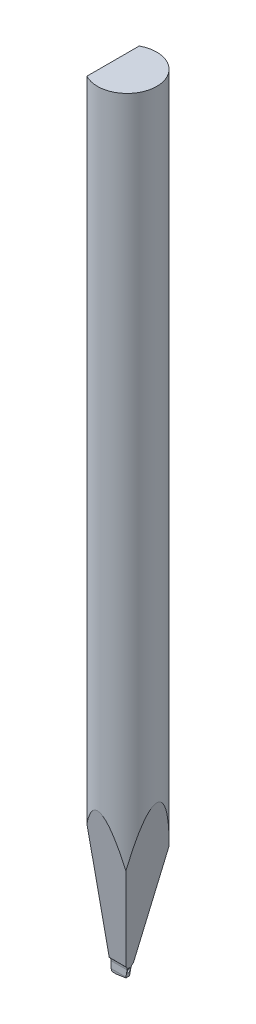
ISO-10303-21;
HEADER;
FILE_DESCRIPTION(('STEP AP214'),'2;1');
FILE_NAME('part.step','',(''),(''),'','','');
FILE_SCHEMA(('AUTOMOTIVE_DESIGN { 1 0 10303 214 1 1 1 1 }'));
ENDSEC;
DATA;
#1=APPLICATION_CONTEXT('core data for automotive mechanical design processes');
#2=APPLICATION_PROTOCOL_DEFINITION('international standard','automotive_design',2000,#1);
#3=PRODUCT_CONTEXT('',#1,'mechanical');
#4=PRODUCT('Part','Part','',(#3));
#5=PRODUCT_RELATED_PRODUCT_CATEGORY('part','',(#4));
#6=PRODUCT_DEFINITION_FORMATION('','',#4);
#7=PRODUCT_DEFINITION_CONTEXT('part definition',#1,'design');
#8=PRODUCT_DEFINITION('design','',#6,#7);
#9=PRODUCT_DEFINITION_SHAPE('','',#8);
#10=(LENGTH_UNIT() NAMED_UNIT(*) SI_UNIT(.MILLI.,.METRE.));
#11=(NAMED_UNIT(*) PLANE_ANGLE_UNIT() SI_UNIT($,.RADIAN.));
#12=(NAMED_UNIT(*) SI_UNIT($,.STERADIAN.) SOLID_ANGLE_UNIT());
#13=UNCERTAINTY_MEASURE_WITH_UNIT(LENGTH_MEASURE(1.E-05),#10,'distance_accuracy_value','');
#14=(GEOMETRIC_REPRESENTATION_CONTEXT(3) GLOBAL_UNCERTAINTY_ASSIGNED_CONTEXT((#13)) GLOBAL_UNIT_ASSIGNED_CONTEXT((#10,
#11,#12)) REPRESENTATION_CONTEXT('',''));
#15=CARTESIAN_POINT('',(0.,0.,0.));
#16=DIRECTION('',(0.,0.,1.));
#17=DIRECTION('',(1.,0.,0.));
#18=AXIS2_PLACEMENT_3D('',#15,#16,#17);
#19=CARTESIAN_POINT('',(26.8389469491216,-0.126489968,0.));
#20=DIRECTION('',(-1.,0.,0.));
#21=DIRECTION('',(0.,0.,1.));
#22=AXIS2_PLACEMENT_3D('',#19,#20,#21);
#23=CYLINDRICAL_SURFACE('',#22,0.12954);
#24=DIRECTION('',(-1.,0.,0.));
#25=VECTOR('',#24,1.);
#26=CARTESIAN_POINT('',(26.8389469491216,0.00289430113655306,-0.00635));
#27=LINE('',#26,#25);
#28=CARTESIAN_POINT('',(-0.337230459838859,0.00289430113655353,-0.00635));
#29=VERTEX_POINT('',#28);
#30=CARTESIAN_POINT('',(-0.322517644099109,0.00289430113655363,-0.00635));
#31=VERTEX_POINT('',#30);
#32=EDGE_CURVE('E255',#29,#31,#27,.F.);
#33=ORIENTED_EDGE('',*,*,#32,.F.);
#34=CARTESIAN_POINT('',(-0.69271081772419,-0.126489968,0.));
#35=DIRECTION('',(-0.342020143325664,0.93969262078591,0.));
#36=DIRECTION('',(-0.93969262078591,-0.342020143325664,0.));
#37=AXIS2_PLACEMENT_3D('',#34,#35,#36);
#38=ELLIPSE('',#37,0.378749621997132,0.12954);
#39=CARTESIAN_POINT('',(-0.337230459838859,0.00289430113655353,0.00635));
#40=VERTEX_POINT('',#39);
#41=EDGE_CURVE('E248',#29,#40,#38,.F.);
#42=ORIENTED_EDGE('',*,*,#41,.T.);
#43=DIRECTION('',(-1.,0.,0.));
#44=VECTOR('',#43,1.);
#45=CARTESIAN_POINT('',(26.8389469491216,0.00289430113655306,0.00635));
#46=LINE('',#45,#44);
#47=CARTESIAN_POINT('',(-0.322517644099109,0.00289430113655363,0.00635));
#48=VERTEX_POINT('',#47);
#49=EDGE_CURVE('E242',#40,#48,#46,.F.);
#50=ORIENTED_EDGE('',*,*,#49,.T.);
#51=CARTESIAN_POINT('',(-0.295481475982011,0.000535429460507921,-0.0254));
#52=CARTESIAN_POINT('',(-0.297198816837772,0.000534215832045812,-0.0254008537884807));
#53=CARTESIAN_POINT('',(-0.298919188823835,0.000561492688278354,-0.0252693542141985));
#54=CARTESIAN_POINT('',(-0.302323221500918,0.000668085088640239,-0.0247303484357372));
#55=CARTESIAN_POINT('',(-0.304006644366186,0.00074767088315698,-0.0243214085003927));
#56=CARTESIAN_POINT('',(-0.307281423892028,0.000954246567589712,-0.0232138391776755));
#57=CARTESIAN_POINT('',(-0.308872395127258,0.00108142046193833,-0.022514084145628));
#58=CARTESIAN_POINT('',(-0.311888705466639,0.00136727278414656,-0.0208294490435858));
#59=CARTESIAN_POINT('',(-0.313314453656703,0.00152587064657108,-0.019845295222508));
#60=CARTESIAN_POINT('',(-0.315802552560778,0.00183491730266456,-0.017729896179951));
#61=CARTESIAN_POINT('',(-0.31688733090877,0.00198447720949578,-0.0166248895362638));
#62=CARTESIAN_POINT('',(-0.318834628353974,0.00227153607517136,-0.014231435594532));
#63=CARTESIAN_POINT('',(-0.319697146095778,0.00240903496046091,-0.0129429871778831));
#64=CARTESIAN_POINT('',(-0.321101404041129,0.00264253512620201,-0.0103422488392302));
#65=CARTESIAN_POINT('',(-0.321664418803657,0.00274109517359781,-0.00904163422654978));
#66=CARTESIAN_POINT('',(-0.322557107099311,0.0029007283002986,-0.006360700983063));
#67=CARTESIAN_POINT('',(-0.322886873312254,0.00296181626761226,-0.00498041424553057));
#68=CARTESIAN_POINT('',(-0.323294507475622,0.00303774254032754,-0.00223556775882093));
#69=CARTESIAN_POINT('',(-0.323381442228622,0.00305424477524811,-0.000872392083877149));
#70=CARTESIAN_POINT('',(-0.323326902262496,0.00304397780016551,0.00184919772746693));
#71=CARTESIAN_POINT('',(-0.323185442856485,0.00301721149118319,0.00320761217697293));
#72=CARTESIAN_POINT('',(-0.322680814845049,0.00292384915717186,0.00586785072119308));
#73=CARTESIAN_POINT('',(-0.322319738671362,0.00285762915339363,0.00717008616312412));
#74=CARTESIAN_POINT('',(-0.321388608005533,0.00269291180724166,0.00969522980929863));
#75=CARTESIAN_POINT('',(-0.32081855750335,0.00259441508113291,0.0109181395275877));
#76=CARTESIAN_POINT('',(-0.319480287297602,0.00237464209728323,0.0132637439490038));
#77=CARTESIAN_POINT('',(-0.318710192462401,0.00225315341778143,0.014385347177932));
#78=CARTESIAN_POINT('',(-0.316998432307603,0.00200089434029428,0.0164873592595305));
#79=CARTESIAN_POINT('',(-0.316056755837209,0.00187012333940415,0.0174677589282051));
#80=CARTESIAN_POINT('',(-0.313995064049818,0.00160792328998953,0.0192984032571108));
#81=CARTESIAN_POINT('',(-0.312870012632793,0.00147662750217606,0.0201429832465612));
#82=CARTESIAN_POINT('',(-0.310500423350918,0.00123093130211308,0.0216463862671867));
#83=CARTESIAN_POINT('',(-0.309255837624392,0.00111653770444698,0.0223051344719556));
#84=CARTESIAN_POINT('',(-0.30658799406044,0.000907155794846376,0.0234725569596421));
#85=CARTESIAN_POINT('',(-0.305158324318323,0.000814175030349454,0.0239668925489424));
#86=CARTESIAN_POINT('',(-0.302240803964317,0.000666682258769199,0.0247378411086488));
#87=CARTESIAN_POINT('',(-0.300752967484489,0.00061216096820831,0.0250145066228529));
#88=CARTESIAN_POINT('',(-0.298000997202902,0.000549419787353061,0.0253297889719289));
#89=CARTESIAN_POINT('',(-0.296740602874197,0.000535029310542213,0.0254002304027708));
#90=CARTESIAN_POINT('',(-0.29548147598203,0.000535429460480635,0.0254000000001634));
#91=B_SPLINE_CURVE_WITH_KNOTS('',3,(#51,#52,#53,#54,#55,#56,#57,#58,#59,#60,#61,#62,#63,#64,#65,
#66,#67,#68,#69,#70,#71,#72,#73,#74,#75,#76,#77,#78,#79,#80,#81,#82,#83,#84,#85,#86,#87,#88,#89,
#90),.UNSPECIFIED.,.F.,.F.,(4,2,2,2,2,2,2,2,2,2,2,2,2,2,2,2,2,2,2,4),(0.,0.00515143035645815,
0.0103296866486899,0.0155281756590848,0.020713505225648,0.025355200998644,0.0299969250773136,
0.0342376571652065,0.0384767032773336,0.0425552102633464,0.0466334438095344,0.0506734171044807,
0.0547133132680188,0.0587925373515595,0.0628720266314898,0.0670924109282963,0.0713144921732156,
0.0758426019125559,0.080369618267126,0.0841472441212815),.UNSPECIFIED.);
#92=CARTESIAN_POINT('',(-0.295481475982011,0.000535429460507854,0.0254));
#93=VERTEX_POINT('',#92);
#94=EDGE_CURVE('E453',#48,#93,#91,.T.);
#95=ORIENTED_EDGE('',*,*,#94,.T.);
#96=DIRECTION('',(-1.,0.,0.));
#97=VECTOR('',#96,1.);
#98=CARTESIAN_POINT('',(26.8389469491216,0.000535429460507867,0.0254));
#99=LINE('',#98,#97);
#100=CARTESIAN_POINT('',(-0.248423428634931,0.000535429460507867,0.0254));
#101=VERTEX_POINT('',#100);
#102=EDGE_CURVE('E452',#101,#93,#99,.T.);
#103=ORIENTED_EDGE('',*,*,#102,.F.);
#104=CARTESIAN_POINT('',(-0.968820255882422,-0.126489968,0.));
#105=DIRECTION('',(-0.173648177666931,0.984807753012208,0.));
#106=DIRECTION('',(-0.984807753012208,-0.173648177666931,0.));
#107=AXIS2_PLACEMENT_3D('',#104,#105,#106);
#108=ELLIPSE('',#107,0.745991128386422,0.12954);
#109=CARTESIAN_POINT('',(-0.251459999999998,0.,0.0279445807869608));
#110=VERTEX_POINT('',#109);
#111=EDGE_CURVE('E296',#110,#101,#108,.T.);
#112=ORIENTED_EDGE('',*,*,#111,.F.);
#113=DIRECTION('',(-1.,0.,0.));
#114=VECTOR('',#113,1.);
#115=CARTESIAN_POINT('',(26.8389469491216,0.,0.0279445807869608));
#116=LINE('',#115,#114);
#117=CARTESIAN_POINT('',(-0.34798,0.,0.0279445807869622));
#118=VERTEX_POINT('',#117);
#119=EDGE_CURVE('E294',#110,#118,#116,.T.);
#120=ORIENTED_EDGE('',*,*,#119,.T.);
#121=CARTESIAN_POINT('',(-0.34798,0.,-0.0279445807869606));
#122=CARTESIAN_POINT('',(-0.348349091560137,-2.4373302072914E-07,-0.0279454827250861));
#123=CARTESIAN_POINT('',(-0.348716992702763,7.30455545849744E-06,-0.027911524894726));
#124=CARTESIAN_POINT('',(-0.349437311610174,3.57943309148719E-05,-0.0277821927914644));
#125=CARTESIAN_POINT('',(-0.349789854795058,5.65882766986827E-05,-0.0276874950113475));
#126=CARTESIAN_POINT('',(-0.350551541254243,0.000115384443904732,-0.0274174753498539));
#127=CARTESIAN_POINT('',(-0.350955676433414,0.000156197752376119,-0.0272288462403929));
#128=CARTESIAN_POINT('',(-0.351728442445497,0.000249838675001402,-0.0267896265213341));
#129=CARTESIAN_POINT('',(-0.352096906430402,0.000302719198042446,-0.0265387626071171));
#130=CARTESIAN_POINT('',(-0.352987990871671,0.000446986634364566,-0.0258419279073664));
#131=CARTESIAN_POINT('',(-0.35348475176395,0.000543619231949299,-0.0253642738293868));
#132=CARTESIAN_POINT('',(-0.354400138333894,0.00074360279413547,-0.0243414479839429));
#133=CARTESIAN_POINT('',(-0.354818597467352,0.000846967462366163,-0.0237961363156788));
#134=CARTESIAN_POINT('',(-0.355929384345129,0.00114406583280984,-0.0221657254862628));
#135=CARTESIAN_POINT('',(-0.356540781287296,0.0013376977161602,-0.0210259820631102));
#136=CARTESIAN_POINT('',(-0.357601033668396,0.00170296073427158,-0.0186716471645337));
#137=CARTESIAN_POINT('',(-0.358049459785676,0.00187453299982006,-0.0174568677158935));
#138=CARTESIAN_POINT('',(-0.359200026139001,0.00233800773549144,-0.0137825108091964));
#139=CARTESIAN_POINT('',(-0.359724536071804,0.00258457419140596,-0.0112617324972563));
#140=CARTESIAN_POINT('',(-0.360438707859998,0.00292899699416231,-0.0061610587996901));
#141=CARTESIAN_POINT('',(-0.360627122142513,0.00302629909173391,-0.00358097901665116));
#142=CARTESIAN_POINT('',(-0.360708928405687,0.00306784876787628,0.00181521156565399));
#143=CARTESIAN_POINT('',(-0.360574527394296,0.00299768116722435,0.00463186266368362));
#144=CARTESIAN_POINT('',(-0.359922127078579,0.0026774730585895,0.0102002605533267));
#145=CARTESIAN_POINT('',(-0.35940661154199,0.00242859751127472,0.0129523090918375));
#146=CARTESIAN_POINT('',(-0.358378032769804,0.00200579430050119,0.0164362267516784));
#147=CARTESIAN_POINT('',(-0.358109729772692,0.00189902690428334,0.017249220407543));
#148=CARTESIAN_POINT('',(-0.357509302574654,0.00167325976975904,0.0188534584464148));
#149=CARTESIAN_POINT('',(-0.357176950463404,0.00155421707662395,0.0196446132674766));
#150=CARTESIAN_POINT('',(-0.356340595598206,0.00127563253536291,0.021390016707206));
#151=CARTESIAN_POINT('',(-0.355814429821229,0.00111358611675536,0.0223334443990135));
#152=CARTESIAN_POINT('',(-0.354603803947176,0.000789252325048008,0.0241124167776409));
#153=CARTESIAN_POINT('',(-0.35392048309961,0.000626974660981518,0.0249486735063971));
#154=CARTESIAN_POINT('',(-0.35281996146287,0.000420593239898147,0.025969486264748));
#155=CARTESIAN_POINT('',(-0.352489132408333,0.00036401176971145,0.0262439796314585));
#156=CARTESIAN_POINT('',(-0.351791822054152,0.000258987609793047,0.0267465626071259));
#157=CARTESIAN_POINT('',(-0.351425327200929,0.000210548033332652,0.0269746344725773));
#158=CARTESIAN_POINT('',(-0.350653121584307,0.000125424000013267,0.027371452843003));
#159=CARTESIAN_POINT('',(-0.350246941268389,8.89101653930784E-05,0.0275393413503319));
#160=CARTESIAN_POINT('',(-0.349408972561741,3.34478546745724E-05,0.0277930649446902));
#161=CARTESIAN_POINT('',(-0.348977292078239,1.44303146265653E-05,0.0278792226936788));
#162=CARTESIAN_POINT('',(-0.348448630577627,3.76997817881845E-06,0.0279275097565269));
#163=CARTESIAN_POINT('',(-0.348355005223824,2.35768920915158E-06,0.0279339061279444));
#164=CARTESIAN_POINT('',(-0.348167600294475,4.74566344676837E-07,0.0279424338228166));
#165=CARTESIAN_POINT('',(-0.348073820826224,3.23663282567614E-09,0.0279445673924581));
#166=CARTESIAN_POINT('',(-0.34798,0.,0.0279445807869634));
#167=B_SPLINE_CURVE_WITH_KNOTS('',3,(#121,#122,#123,#124,#125,#126,#127,#128,#129,#130,#131,
#132,#133,#134,#135,#136,#137,#138,#139,#140,#141,#142,#143,#144,#145,#146,#147,#148,#149,#150,
#151,#152,#153,#154,#155,#156,#157,#158,#159,#160,#161,#162,#163,#164,#165,#166),.UNSPECIFIED.,
.F.,.F.,(4,2,2,2,2,2,2,2,2,2,2,2,2,2,2,2,2,2,2,2,2,2,4),(0.,0.00110371371287312,
0.00219534333891931,0.00353146900358845,0.00487356949290073,0.0069494506178281,
0.00902969806785878,0.0129309924202898,0.0168424908877766,0.0245596001059434,0.032305295764015,
0.040741385586484,0.0491229757730261,0.0517092769992483,0.0543049570838417,0.0575728211295654,
0.0608177034752608,0.062115373680452,0.0634135389613502,0.0647295372738637,0.0660403183123416,
0.0663218213263228,0.0666031759695123),.UNSPECIFIED.);
#168=CARTESIAN_POINT('',(-0.347980000000001,0.,-0.0279445807869607));
#169=VERTEX_POINT('',#168);
#170=EDGE_CURVE('E422',#169,#118,#167,.T.);
#171=ORIENTED_EDGE('',*,*,#170,.F.);
#172=DIRECTION('',(-1.,0.,0.));
#173=VECTOR('',#172,1.);
#174=CARTESIAN_POINT('',(26.8389469491216,0.,-0.0279445807869607));
#175=LINE('',#174,#173);
#176=CARTESIAN_POINT('',(-0.251459999999998,0.,-0.0279445807869607));
#177=VERTEX_POINT('',#176);
#178=EDGE_CURVE('E290',#177,#169,#175,.T.);
#179=ORIENTED_EDGE('',*,*,#178,.F.);
#180=CARTESIAN_POINT('',(-0.248423428634931,0.000535429460507867,-0.0254));
#181=VERTEX_POINT('',#180);
#182=EDGE_CURVE('E293',#181,#177,#108,.T.);
#183=ORIENTED_EDGE('',*,*,#182,.F.);
#184=DIRECTION('',(-1.,0.,0.));
#185=VECTOR('',#184,1.);
#186=CARTESIAN_POINT('',(26.8389469491216,0.000535429460507867,-0.0254));
#187=LINE('',#186,#185);
#188=CARTESIAN_POINT('',(-0.295481475982011,0.000535429460507447,-0.0254));
#189=VERTEX_POINT('',#188);
#190=EDGE_CURVE('E431',#181,#189,#187,.T.);
#191=ORIENTED_EDGE('',*,*,#190,.T.);
#192=EDGE_CURVE('E445',#189,#31,#91,.T.);
#193=ORIENTED_EDGE('',*,*,#192,.T.);
#194=EDGE_LOOP('',(#33,#42,#50,#95,#103,#112,#120,#171,#179,#183,#191,#193));
#195=FACE_BOUND('',#194,.T.);
#196=ADVANCED_FACE('F43',(#195),#23,.F.);
#197=CARTESIAN_POINT('',(-0.242997697710467,0.09144,0.));
#198=DIRECTION('',(-0.500000000000004,-0.866025403784436,0.));
#199=DIRECTION('',(0.866025403784436,-0.500000000000004,0.));
#200=AXIS2_PLACEMENT_3D('',#197,#198,#199);
#201=CYLINDRICAL_SURFACE('',#200,0.0254);
#202=DIRECTION('',(-0.500000000000004,-0.866025403784436,0.));
#203=VECTOR('',#202,1.);
#204=CARTESIAN_POINT('',(-0.264296245196153,0.103736722124209,-0.00635));
#205=LINE('',#204,#203);
#206=CARTESIAN_POINT('',(-0.319782486856643,0.00763173244719604,-0.00635));
#207=VERTEX_POINT('',#206);
#208=EDGE_CURVE('E11',#31,#207,#205,.F.);
#209=ORIENTED_EDGE('',*,*,#208,.F.);
#210=ORIENTED_EDGE('',*,*,#192,.F.);
#211=DIRECTION('',(0.500000000000004,0.866025403784436,0.));
#212=VECTOR('',#211,1.);
#213=CARTESIAN_POINT('',(-0.242997697710467,0.09144,-0.0254));
#214=LINE('',#213,#212);
#215=CARTESIAN_POINT('',(-0.242997697710467,0.09144,-0.0254));
#216=VERTEX_POINT('',#215);
#217=EDGE_CURVE('E66',#189,#216,#214,.T.);
#218=ORIENTED_EDGE('',*,*,#217,.T.);
#219=CARTESIAN_POINT('',(-0.242997697710467,0.09144,0.));
#220=DIRECTION('',(0.,-1.,0.));
#221=DIRECTION('',(-1.,0.,0.));
#222=AXIS2_PLACEMENT_3D('',#219,#220,#221);
#223=ELLIPSE('',#222,0.0293293936748331,0.0254);
#224=CARTESIAN_POINT('',(-0.242997697710467,0.09144,0.0254));
#225=VERTEX_POINT('',#224);
#226=EDGE_CURVE('E282',#216,#225,#223,.F.);
#227=ORIENTED_EDGE('',*,*,#226,.T.);
#228=DIRECTION('',(-0.500000000000004,-0.866025403784436,0.));
#229=VECTOR('',#228,1.);
#230=CARTESIAN_POINT('',(-0.221842954743874,0.128081089639199,0.0254));
#231=LINE('',#230,#229);
#232=EDGE_CURVE('E278',#225,#93,#231,.T.);
#233=ORIENTED_EDGE('',*,*,#232,.T.);
#234=ORIENTED_EDGE('',*,*,#94,.F.);
#235=DIRECTION('',(-0.500000000000004,-0.866025403784436,0.));
#236=VECTOR('',#235,1.);
#237=CARTESIAN_POINT('',(-0.264296245196153,0.103736722124209,0.00635));
#238=LINE('',#237,#236);
#239=CARTESIAN_POINT('',(-0.319782486856643,0.00763173244719592,0.00635));
#240=VERTEX_POINT('',#239);
#241=EDGE_CURVE('E460',#48,#240,#238,.F.);
#242=ORIENTED_EDGE('',*,*,#241,.T.);
#243=CARTESIAN_POINT('',(-0.319782486856643,-0.0415551560496378,0.));
#244=DIRECTION('',(1.,0.,0.));
#245=DIRECTION('',(0.,-1.,0.));
#246=AXIS2_PLACEMENT_3D('',#243,#244,#245);
#247=ELLIPSE('',#246,0.0507999999999996,0.0254);
#248=CARTESIAN_POINT('',(-0.319782486856643,0.00924484395036186,0.));
#249=VERTEX_POINT('',#248);
#250=EDGE_CURVE('E462',#240,#249,#247,.F.);
#251=ORIENTED_EDGE('',*,*,#250,.T.);
#252=EDGE_CURVE('E51',#249,#207,#247,.F.);
#253=ORIENTED_EDGE('',*,*,#252,.T.);
#254=EDGE_LOOP('',(#209,#210,#218,#227,#233,#234,#242,#251,#253));
#255=FACE_BOUND('',#254,.T.);
#256=ADVANCED_FACE('F439',(#255),#201,.F.);
#257=CARTESIAN_POINT('',(-0.25146,0.,26.5302437568316));
#258=DIRECTION('',(-0.173648177666931,0.984807753012208,0.));
#259=DIRECTION('',(-0.984807753012208,-0.173648177666931,0.));
#260=AXIS2_PLACEMENT_3D('',#257,#258,#259);
#261=PLANE('',#260);
#262=DIRECTION('',(-0.984807753012208,-0.173648177666931,0.));
#263=VECTOR('',#262,1.);
#264=CARTESIAN_POINT('',(-0.25146,0.,0.0253999999999983));
#265=LINE('',#264,#263);
#266=CARTESIAN_POINT('',(-0.1397,0.0197063033639782,0.0253999999999992));
#267=VERTEX_POINT('',#266);
#268=EDGE_CURVE('E287',#267,#101,#265,.T.);
#269=ORIENTED_EDGE('',*,*,#268,.F.);
#270=DIRECTION('',(0.,0.,1.));
#271=VECTOR('',#270,1.);
#272=CARTESIAN_POINT('',(-0.1397,0.0197063033639782,26.5302437568316));
#273=LINE('',#272,#271);
#274=CARTESIAN_POINT('',(-0.1397,0.0197063033639782,-0.0253999999999992));
#275=VERTEX_POINT('',#274);
#276=EDGE_CURVE('E456',#275,#267,#273,.T.);
#277=ORIENTED_EDGE('',*,*,#276,.F.);
#278=DIRECTION('',(-0.984807753012208,-0.173648177666931,0.));
#279=VECTOR('',#278,1.);
#280=CARTESIAN_POINT('',(-0.25146,0.,-0.0253999999999983));
#281=LINE('',#280,#279);
#282=EDGE_CURVE('E284',#275,#181,#281,.T.);
#283=ORIENTED_EDGE('',*,*,#282,.T.);
#284=ORIENTED_EDGE('',*,*,#182,.T.);
#285=DIRECTION('',(0.,0.,-1.));
#286=VECTOR('',#285,1.);
#287=CARTESIAN_POINT('',(-0.25146,0.,26.5302437568316));
#288=LINE('',#287,#286);
#289=CARTESIAN_POINT('',(-0.251459999999995,0.,-0.0381000000000001));
#290=VERTEX_POINT('',#289);
#291=EDGE_CURVE('E312',#177,#290,#288,.T.);
#292=ORIENTED_EDGE('',*,*,#291,.T.);
#293=DIRECTION('',(0.984346441568213,0.173566836012845,-0.0306045161452665));
#294=VECTOR('',#293,1.);
#295=CARTESIAN_POINT('',(26.031302637475,4.63436018054325,-0.855262738150733));
#296=LINE('',#295,#294);
#297=CARTESIAN_POINT('',(0.0133120828754885,0.0466864619493258,-0.0463320828754853));
#298=VERTEX_POINT('',#297);
#299=EDGE_CURVE('E416',#290,#298,#296,.T.);
#300=ORIENTED_EDGE('',*,*,#299,.T.);
#301=DIRECTION('',(0.,0.,-1.));
#302=VECTOR('',#301,1.);
#303=CARTESIAN_POINT('',(0.0133120828754853,0.0466864619493261,26.5302437568316));
#304=LINE('',#303,#302);
#305=CARTESIAN_POINT('',(0.0133120828754885,0.0466864619493258,0.0463320828754853));
#306=VERTEX_POINT('',#305);
#307=EDGE_CURVE('E309',#306,#298,#304,.T.);
#308=ORIENTED_EDGE('',*,*,#307,.F.);
#309=DIRECTION('',(-0.984346441568213,-0.173566836012845,-0.0306045161452665));
#310=VECTOR('',#309,1.);
#311=CARTESIAN_POINT('',(26.031302637475,4.63436018054325,0.855262738150733));
#312=LINE('',#311,#310);
#313=CARTESIAN_POINT('',(-0.251459999999995,0.,0.0381000000000001));
#314=VERTEX_POINT('',#313);
#315=EDGE_CURVE('E345',#306,#314,#312,.T.);
#316=ORIENTED_EDGE('',*,*,#315,.T.);
#317=EDGE_CURVE('E313',#314,#110,#288,.T.);
#318=ORIENTED_EDGE('',*,*,#317,.T.);
#319=ORIENTED_EDGE('',*,*,#111,.T.);
#320=EDGE_LOOP('',(#269,#277,#283,#284,#292,#300,#308,#316,#318,#319));
#321=FACE_BOUND('',#320,.T.);
#322=ADVANCED_FACE('F492',(#321),#261,.F.);
#323=CARTESIAN_POINT('',(0.,0.,0.));
#324=DIRECTION('',(0.,1.,0.));
#325=DIRECTION('',(0.,0.,1.));
#326=AXIS2_PLACEMENT_3D('',#323,#324,#325);
#327=PLANE('',#326);
#328=ORIENTED_EDGE('',*,*,#119,.F.);
#329=ORIENTED_EDGE('',*,*,#317,.F.);
#330=DIRECTION('',(-1.,0.,0.));
#331=VECTOR('',#330,1.);
#332=CARTESIAN_POINT('',(26.8738719491216,0.,0.0381));
#333=LINE('',#332,#331);
#334=CARTESIAN_POINT('',(-0.34798,0.,0.0380999999999965));
#335=VERTEX_POINT('',#334);
#336=EDGE_CURVE('E368',#314,#335,#333,.T.);
#337=ORIENTED_EDGE('',*,*,#336,.T.);
#338=DIRECTION('',(0.,0.,-1.));
#339=VECTOR('',#338,1.);
#340=CARTESIAN_POINT('',(-0.34798,0.,26.4515969491216));
#341=LINE('',#340,#339);
#342=EDGE_CURVE('E300',#335,#118,#341,.T.);
#343=ORIENTED_EDGE('',*,*,#342,.T.);
#344=EDGE_LOOP('',(#328,#329,#337,#343));
#345=FACE_BOUND('',#344,.T.);
#346=ADVANCED_FACE('F495',(#345),#327,.F.);
#347=CARTESIAN_POINT('',(26.8738719491216,0.,0.0381));
#348=DIRECTION('',(0.,-0.173648177666931,0.984807753012208));
#349=DIRECTION('',(0.,-0.984807753012208,-0.173648177666931));
#350=AXIS2_PLACEMENT_3D('',#347,#348,#349);
#351=PLANE('',#350);
#352=CARTESIAN_POINT('',(-0.34798,0.02794,0.043026575840991));
#353=DIRECTION('',(0.,-0.173648177666931,0.984807753012208));
#354=DIRECTION('',(0.,-0.984807753012208,-0.173648177666931));
#355=AXIS2_PLACEMENT_3D('',#352,#353,#354);
#356=ELLIPSE('',#355,0.0283710195360877,0.02794);
#357=CARTESIAN_POINT('',(-0.37592,0.02794,0.043026575840991));
#358=VERTEX_POINT('',#357);
#359=EDGE_CURVE('E303',#335,#358,#356,.F.);
#360=ORIENTED_EDGE('',*,*,#359,.F.);
#361=ORIENTED_EDGE('',*,*,#336,.F.);
#362=ORIENTED_EDGE('',*,*,#315,.F.);
#363=DIRECTION('',(-0.171087869746036,-0.970287525247814,-0.171087869746036));
#364=VECTOR('',#363,1.);
#365=CARTESIAN_POINT('',(0.791557999082992,4.46033837772865,0.824577999082991));
#366=LINE('',#365,#364);
#367=CARTESIAN_POINT('',(0.0177799999999975,0.0720252791091445,0.0508));
#368=VERTEX_POINT('',#367);
#369=EDGE_CURVE('E330',#368,#306,#366,.T.);
#370=ORIENTED_EDGE('',*,*,#369,.F.);
#371=DIRECTION('',(-1.,0.,0.));
#372=VECTOR('',#371,1.);
#373=CARTESIAN_POINT('',(26.8738719491216,0.0720252791091445,0.0508));
#374=LINE('',#373,#372);
#375=CARTESIAN_POINT('',(-0.375919999999998,0.0720252791091445,0.0508));
#376=VERTEX_POINT('',#375);
#377=EDGE_CURVE('E404',#368,#376,#374,.T.);
#378=ORIENTED_EDGE('',*,*,#377,.T.);
#379=DIRECTION('',(0.,0.984807753012208,0.173648177666931));
#380=VECTOR('',#379,1.);
#381=CARTESIAN_POINT('',(-0.37592,20.2115576196122,3.60194293048141));
#382=LINE('',#381,#380);
#383=EDGE_CURVE('E390',#358,#376,#382,.T.);
#384=ORIENTED_EDGE('',*,*,#383,.F.);
#385=EDGE_LOOP('',(#360,#361,#362,#370,#378,#384));
#386=FACE_BOUND('',#385,.T.);
#387=ADVANCED_FACE('F512',(#386),#351,.T.);
#388=CARTESIAN_POINT('',(26.8738719491216,0.,-0.0381));
#389=DIRECTION('',(0.,-0.173648177666931,-0.984807753012208));
#390=DIRECTION('',(0.,0.984807753012208,-0.173648177666931));
#391=AXIS2_PLACEMENT_3D('',#388,#389,#390);
#392=PLANE('',#391);
#393=CARTESIAN_POINT('',(-0.34798,0.02794,-0.0430265758409945));
#394=DIRECTION('',(0.,-0.173648177666931,-0.984807753012208));
#395=DIRECTION('',(0.,0.984807753012208,-0.173648177666931));
#396=AXIS2_PLACEMENT_3D('',#393,#394,#395);
#397=ELLIPSE('',#396,0.0283710195360877,0.02794);
#398=CARTESIAN_POINT('',(-0.37592,0.02794,-0.0430265758409945));
#399=VERTEX_POINT('',#398);
#400=CARTESIAN_POINT('',(-0.34798,0.,-0.0380999999999992));
#401=VERTEX_POINT('',#400);
#402=EDGE_CURVE('E419',#399,#401,#397,.F.);
#403=ORIENTED_EDGE('',*,*,#402,.F.);
#404=DIRECTION('',(0.,-0.984807753012208,0.173648177666931));
#405=VECTOR('',#404,1.);
#406=CARTESIAN_POINT('',(-0.37592,20.5694748591997,-3.66505339668138));
#407=LINE('',#406,#405);
#408=CARTESIAN_POINT('',(-0.375919999999998,0.0720252791091445,-0.0508));
#409=VERTEX_POINT('',#408);
#410=EDGE_CURVE('E392',#409,#399,#407,.T.);
#411=ORIENTED_EDGE('',*,*,#410,.F.);
#412=DIRECTION('',(1.,0.,0.));
#413=VECTOR('',#412,1.);
#414=CARTESIAN_POINT('',(26.8738719491216,0.0720252791091445,-0.0508));
#415=LINE('',#414,#413);
#416=CARTESIAN_POINT('',(0.0177799999999975,0.0720252791091445,-0.0508));
#417=VERTEX_POINT('',#416);
#418=EDGE_CURVE('E396',#409,#417,#415,.T.);
#419=ORIENTED_EDGE('',*,*,#418,.T.);
#420=DIRECTION('',(0.171087869746036,0.970287525247814,-0.171087869746036));
#421=VECTOR('',#420,1.);
#422=CARTESIAN_POINT('',(0.791557999082992,4.46033837772865,-0.824577999082991));
#423=LINE('',#422,#421);
#424=EDGE_CURVE('E342',#298,#417,#423,.T.);
#425=ORIENTED_EDGE('',*,*,#424,.F.);
#426=ORIENTED_EDGE('',*,*,#299,.F.);
#427=DIRECTION('',(-1.,0.,0.));
#428=VECTOR('',#427,1.);
#429=CARTESIAN_POINT('',(26.8738719491216,0.,-0.0381));
#430=LINE('',#429,#428);
#431=EDGE_CURVE('E371',#290,#401,#430,.T.);
#432=ORIENTED_EDGE('',*,*,#431,.T.);
#433=EDGE_LOOP('',(#403,#411,#419,#425,#426,#432));
#434=FACE_BOUND('',#433,.T.);
#435=ADVANCED_FACE('F507',(#434),#392,.T.);
#436=ORIENTED_EDGE('',*,*,#291,.F.);
#437=ORIENTED_EDGE('',*,*,#178,.T.);
#438=EDGE_CURVE('E304',#169,#401,#341,.T.);
#439=ORIENTED_EDGE('',*,*,#438,.T.);
#440=ORIENTED_EDGE('',*,*,#431,.F.);
#441=EDGE_LOOP('',(#436,#437,#439,#440));
#442=FACE_BOUND('',#441,.T.);
#443=ADVANCED_FACE('F502',(#442),#327,.F.);
#444=CARTESIAN_POINT('',(0.,21.0312,0.));
#445=DIRECTION('',(0.,-1.,0.));
#446=DIRECTION('',(0.,0.,-1.));
#447=AXIS2_PLACEMENT_3D('',#444,#445,#446);
#448=CYLINDRICAL_SURFACE('',#447,0.792479999999998);
#449=CARTESIAN_POINT('',(0.,-0.216075837327433,0.));
#450=DIRECTION('',(0.,-0.173648177666931,0.984807753012208));
#451=DIRECTION('',(0.,-0.984807753012208,-0.173648177666931));
#452=AXIS2_PLACEMENT_3D('',#449,#450,#451);
#453=ELLIPSE('',#452,4.56371043248163,0.792479999999998);
#454=CARTESIAN_POINT('',(0.543614713880757,3.05418213206493,0.576634713880755));
#455=VERTEX_POINT('',#454);
#456=CARTESIAN_POINT('',(-0.37592,3.74046620982329,0.69764511322018));
#457=VERTEX_POINT('',#456);
#458=EDGE_CURVE('E374',#455,#457,#453,.T.);
#459=ORIENTED_EDGE('',*,*,#458,.F.);
#460=CARTESIAN_POINT('',(0.,-0.0288101116436568,0.));
#461=DIRECTION('',(-0.984807753012208,0.173648177666931,0.));
#462=DIRECTION('',(-0.173648177666931,-0.984807753012208,0.));
#463=AXIS2_PLACEMENT_3D('',#460,#461,#462);
#464=ELLIPSE('',#463,4.56371043248165,0.792479999999998);
#465=CARTESIAN_POINT('',(0.543614713880757,3.05418213206493,-0.576634713880755));
#466=VERTEX_POINT('',#465);
#467=EDGE_CURVE('E322',#455,#466,#464,.T.);
#468=ORIENTED_EDGE('',*,*,#467,.T.);
#469=CARTESIAN_POINT('',(0.,-0.216075837327433,0.));
#470=DIRECTION('',(0.,-0.173648177666931,-0.984807753012208));
#471=DIRECTION('',(0.,-0.984807753012208,0.173648177666931));
#472=AXIS2_PLACEMENT_3D('',#469,#470,#471);
#473=ELLIPSE('',#472,4.56371043248163,0.792479999999998);
#474=CARTESIAN_POINT('',(-0.37592,3.74046620982329,-0.69764511322018));
#475=VERTEX_POINT('',#474);
#476=EDGE_CURVE('E376',#475,#466,#473,.T.);
#477=ORIENTED_EDGE('',*,*,#476,.F.);
#478=DIRECTION('',(0.,-1.,0.));
#479=VECTOR('',#478,1.);
#480=CARTESIAN_POINT('',(-0.37592,21.0312,-0.69764511322018));
#481=LINE('',#480,#479);
#482=CARTESIAN_POINT('',(-0.37592,21.0312,-0.69764511322018));
#483=VERTEX_POINT('',#482);
#484=EDGE_CURVE('E383',#483,#475,#481,.T.);
#485=ORIENTED_EDGE('',*,*,#484,.F.);
#486=CARTESIAN_POINT('',(0.,21.0312,0.));
#487=DIRECTION('',(0.,1.,0.));
#488=DIRECTION('',(0.,0.,1.));
#489=AXIS2_PLACEMENT_3D('',#486,#487,#488);
#490=CIRCLE('',#489,0.792479999999998);
#491=CARTESIAN_POINT('',(-0.37592,21.0312,0.69764511322018));
#492=VERTEX_POINT('',#491);
#493=EDGE_CURVE('E386',#492,#483,#490,.T.);
#494=ORIENTED_EDGE('',*,*,#493,.F.);
#495=DIRECTION('',(0.,-1.,0.));
#496=VECTOR('',#495,1.);
#497=CARTESIAN_POINT('',(-0.37592,21.0312,0.69764511322018));
#498=LINE('',#497,#496);
#499=EDGE_CURVE('E381',#457,#492,#498,.F.);
#500=ORIENTED_EDGE('',*,*,#499,.F.);
#501=EDGE_LOOP('',(#459,#468,#477,#485,#494,#500));
#502=FACE_BOUND('',#501,.T.);
#503=ADVANCED_FACE('F45',(#502),#448,.T.);
#504=CARTESIAN_POINT('',(-0.37592,21.0312,-1.04648));
#505=DIRECTION('',(-1.,0.,0.));
#506=DIRECTION('',(0.,0.,1.));
#507=AXIS2_PLACEMENT_3D('',#504,#505,#506);
#508=PLANE('',#507);
#509=DIRECTION('',(0.,0.,-1.));
#510=VECTOR('',#509,1.);
#511=CARTESIAN_POINT('',(-0.37592,0.02794,26.4515969491216));
#512=LINE('',#511,#510);
#513=EDGE_CURVE('E299',#358,#399,#512,.T.);
#514=ORIENTED_EDGE('',*,*,#513,.F.);
#515=ORIENTED_EDGE('',*,*,#383,.T.);
#516=DIRECTION('',(0.,1.,0.));
#517=VECTOR('',#516,1.);
#518=CARTESIAN_POINT('',(-0.37592,21.0312,0.0507999999999999));
#519=LINE('',#518,#517);
#520=CARTESIAN_POINT('',(-0.375919999999998,0.254,0.0508));
#521=VERTEX_POINT('',#520);
#522=EDGE_CURVE('E365',#376,#521,#519,.T.);
#523=ORIENTED_EDGE('',*,*,#522,.T.);
#524=CARTESIAN_POINT('',(-0.375919999999998,0.254,0.1778));
#525=DIRECTION('',(-1.,0.,0.));
#526=DIRECTION('',(0.,0.,1.));
#527=AXIS2_PLACEMENT_3D('',#524,#525,#526);
#528=CIRCLE('',#527,0.127);
#529=CARTESIAN_POINT('',(-0.375919999999998,0.343802561210692,0.0879974387893087));
#530=VERTEX_POINT('',#529);
#531=EDGE_CURVE('E407',#521,#530,#528,.F.);
#532=ORIENTED_EDGE('',*,*,#531,.T.);
#533=DIRECTION('',(0.,0.707106781186546,0.707106781186549));
#534=VECTOR('',#533,1.);
#535=CARTESIAN_POINT('',(-0.37592,10.1202625612106,9.86445743878931));
#536=LINE('',#535,#534);
#537=CARTESIAN_POINT('',(-0.375919999999998,0.356822568589389,0.101017446168007));
#538=VERTEX_POINT('',#537);
#539=EDGE_CURVE('E362',#530,#538,#536,.T.);
#540=ORIENTED_EDGE('',*,*,#539,.T.);
#541=EDGE_CURVE('E389',#538,#457,#382,.T.);
#542=ORIENTED_EDGE('',*,*,#541,.T.);
#543=ORIENTED_EDGE('',*,*,#499,.T.);
#544=DIRECTION('',(0.,0.,-1.));
#545=VECTOR('',#544,1.);
#546=CARTESIAN_POINT('',(-0.37592,21.0312,-1.04648));
#547=LINE('',#546,#545);
#548=EDGE_CURVE('E379',#492,#483,#547,.T.);
#549=ORIENTED_EDGE('',*,*,#548,.T.);
#550=ORIENTED_EDGE('',*,*,#484,.T.);
#551=CARTESIAN_POINT('',(-0.375919999999998,0.356822568589389,-0.101017446168007));
#552=VERTEX_POINT('',#551);
#553=EDGE_CURVE('E393',#475,#552,#407,.T.);
#554=ORIENTED_EDGE('',*,*,#553,.T.);
#555=DIRECTION('',(0.,-0.707106781186546,0.707106781186549));
#556=VECTOR('',#555,1.);
#557=CARTESIAN_POINT('',(-0.37592,11.1667425612106,-10.9109374387893));
#558=LINE('',#557,#556);
#559=CARTESIAN_POINT('',(-0.375919999999998,0.343802561210692,-0.0879974387893087));
#560=VERTEX_POINT('',#559);
#561=EDGE_CURVE('E359',#552,#560,#558,.T.);
#562=ORIENTED_EDGE('',*,*,#561,.T.);
#563=CARTESIAN_POINT('',(-0.375919999999998,0.254,-0.1778));
#564=DIRECTION('',(-1.,0.,0.));
#565=DIRECTION('',(0.,0.,1.));
#566=AXIS2_PLACEMENT_3D('',#563,#564,#565);
#567=CIRCLE('',#566,0.127);
#568=CARTESIAN_POINT('',(-0.375919999999998,0.254,-0.0508));
#569=VERTEX_POINT('',#568);
#570=EDGE_CURVE('E410',#560,#569,#567,.F.);
#571=ORIENTED_EDGE('',*,*,#570,.T.);
#572=DIRECTION('',(0.,-1.,0.));
#573=VECTOR('',#572,1.);
#574=CARTESIAN_POINT('',(-0.37592,21.0312,-0.0507999999999999));
#575=LINE('',#574,#573);
#576=EDGE_CURVE('E356',#569,#409,#575,.T.);
#577=ORIENTED_EDGE('',*,*,#576,.T.);
#578=ORIENTED_EDGE('',*,*,#410,.T.);
#579=EDGE_LOOP('',(#514,#515,#523,#532,#540,#542,#543,#549,#550,#554,#562,#571,#577,#578));
#580=FACE_BOUND('',#579,.T.);
#581=ADVANCED_FACE('F517',(#580),#508,.T.);
#582=DIRECTION('',(-0.171087869746036,-0.970287525247814,-0.171087869746036));
#583=VECTOR('',#582,1.);
#584=CARTESIAN_POINT('',(0.791557999082992,4.46033837772865,0.824577999082991));
#585=LINE('',#584,#583);
#586=CARTESIAN_POINT('',(0.0679974461680084,0.35682256858939,0.101017446168006));
#587=VERTEX_POINT('',#586);
#588=EDGE_CURVE('E319',#455,#587,#585,.T.);
#589=ORIENTED_EDGE('',*,*,#588,.F.);
#590=ORIENTED_EDGE('',*,*,#458,.T.);
#591=ORIENTED_EDGE('',*,*,#541,.F.);
#592=DIRECTION('',(1.,0.,0.));
#593=VECTOR('',#592,1.);
#594=CARTESIAN_POINT('',(26.8738719491216,0.356822568589389,0.101017446168007));
#595=LINE('',#594,#593);
#596=EDGE_CURVE('E401',#538,#587,#595,.T.);
#597=ORIENTED_EDGE('',*,*,#596,.T.);
#598=EDGE_LOOP('',(#589,#590,#591,#597));
#599=FACE_BOUND('',#598,.T.);
#600=ADVANCED_FACE('F546',(#599),#351,.T.);
#601=DIRECTION('',(0.171087869746036,0.970287525247814,-0.171087869746036));
#602=VECTOR('',#601,1.);
#603=CARTESIAN_POINT('',(0.791557999082992,4.46033837772865,-0.824577999082991));
#604=LINE('',#603,#602);
#605=CARTESIAN_POINT('',(0.0679974461680084,0.35682256858939,-0.101017446168006));
#606=VERTEX_POINT('',#605);
#607=EDGE_CURVE('E327',#606,#466,#604,.T.);
#608=ORIENTED_EDGE('',*,*,#607,.F.);
#609=DIRECTION('',(-1.,0.,0.));
#610=VECTOR('',#609,1.);
#611=CARTESIAN_POINT('',(26.8738719491216,0.356822568589389,-0.101017446168007));
#612=LINE('',#611,#610);
#613=EDGE_CURVE('E399',#606,#552,#612,.T.);
#614=ORIENTED_EDGE('',*,*,#613,.T.);
#615=ORIENTED_EDGE('',*,*,#553,.F.);
#616=ORIENTED_EDGE('',*,*,#476,.T.);
#617=EDGE_LOOP('',(#608,#614,#615,#616));
#618=FACE_BOUND('',#617,.T.);
#619=ADVANCED_FACE('F533',(#618),#392,.T.);
#620=CARTESIAN_POINT('',(0.,21.0312,0.));
#621=DIRECTION('',(0.,1.,0.));
#622=DIRECTION('',(0.,0.,1.));
#623=AXIS2_PLACEMENT_3D('',#620,#621,#622);
#624=PLANE('',#623);
#625=ORIENTED_EDGE('',*,*,#493,.T.);
#626=ORIENTED_EDGE('',*,*,#548,.F.);
#627=EDGE_LOOP('',(#625,#626));
#628=FACE_BOUND('',#627,.T.);
#629=ADVANCED_FACE('F543',(#628),#624,.T.);
#630=CARTESIAN_POINT('',(26.8738719491216,0.,-0.0508));
#631=DIRECTION('',(0.,0.,-1.));
#632=DIRECTION('',(-1.,0.,0.));
#633=AXIS2_PLACEMENT_3D('',#630,#631,#632);
#634=PLANE('',#633);
#635=DIRECTION('',(0.173648177666931,0.984807753012208,0.));
#636=VECTOR('',#635,1.);
#637=CARTESIAN_POINT('',(0.815273212550104,4.59483403671308,-0.0508));
#638=LINE('',#637,#636);
#639=CARTESIAN_POINT('',(0.0498670530999501,0.254,-0.0508));
#640=VERTEX_POINT('',#639);
#641=EDGE_CURVE('E339',#417,#640,#638,.T.);
#642=ORIENTED_EDGE('',*,*,#641,.F.);
#643=ORIENTED_EDGE('',*,*,#418,.F.);
#644=ORIENTED_EDGE('',*,*,#576,.F.);
#645=DIRECTION('',(-1.,0.,0.));
#646=VECTOR('',#645,1.);
#647=CARTESIAN_POINT('',(26.8738719491216,0.254,-0.0508));
#648=LINE('',#647,#646);
#649=EDGE_CURVE('E352',#640,#569,#648,.T.);
#650=ORIENTED_EDGE('',*,*,#649,.F.);
#651=EDGE_LOOP('',(#642,#643,#644,#650));
#652=FACE_BOUND('',#651,.T.);
#653=ADVANCED_FACE('F523',(#652),#634,.T.);
#654=CARTESIAN_POINT('',(26.8738719491216,0.343802561210692,-0.0879974387893087));
#655=DIRECTION('',(0.,-0.707106781186549,-0.707106781186546));
#656=DIRECTION('',(0.,0.707106781186546,-0.707106781186549));
#657=AXIS2_PLACEMENT_3D('',#654,#655,#656);
#658=PLANE('',#657);
#659=DIRECTION('',(0.123724030206484,0.701673843159862,-0.701673843159865));
#660=VECTOR('',#659,1.);
#661=CARTESIAN_POINT('',(0.476071370705485,2.67112479787883,-2.41531967545746));
#662=LINE('',#661,#660);
#663=CARTESIAN_POINT('',(0.0657016675781191,0.343802561210692,-0.0879974387893087));
#664=VERTEX_POINT('',#663);
#665=EDGE_CURVE('E333',#664,#606,#662,.T.);
#666=ORIENTED_EDGE('',*,*,#665,.F.);
#667=DIRECTION('',(-1.,0.,0.));
#668=VECTOR('',#667,1.);
#669=CARTESIAN_POINT('',(26.8738719491216,0.343802561210692,-0.0879974387893087));
#670=LINE('',#669,#668);
#671=EDGE_CURVE('E354',#664,#560,#670,.T.);
#672=ORIENTED_EDGE('',*,*,#671,.T.);
#673=ORIENTED_EDGE('',*,*,#561,.F.);
#674=ORIENTED_EDGE('',*,*,#613,.F.);
#675=EDGE_LOOP('',(#666,#672,#673,#674));
#676=FACE_BOUND('',#675,.T.);
#677=ADVANCED_FACE('F530',(#676),#658,.T.);
#678=CARTESIAN_POINT('',(26.8738719491216,0.254,-0.1778));
#679=DIRECTION('',(-1.,0.,0.));
#680=DIRECTION('',(0.,0.,1.));
#681=AXIS2_PLACEMENT_3D('',#678,#679,#680);
#682=CYLINDRICAL_SURFACE('',#681,0.127);
#683=CARTESIAN_POINT('',(0.0498670530999501,0.254,-0.1778));
#684=DIRECTION('',(-0.984807753012208,0.173648177666931,0.));
#685=DIRECTION('',(-0.173648177666931,-0.984807753012208,0.));
#686=AXIS2_PLACEMENT_3D('',#683,#684,#685);
#687=ELLIPSE('',#686,0.12895917970949,0.127);
#688=EDGE_CURVE('E336',#640,#664,#687,.T.);
#689=ORIENTED_EDGE('',*,*,#688,.F.);
#690=ORIENTED_EDGE('',*,*,#649,.T.);
#691=ORIENTED_EDGE('',*,*,#570,.F.);
#692=ORIENTED_EDGE('',*,*,#671,.F.);
#693=EDGE_LOOP('',(#689,#690,#691,#692));
#694=FACE_BOUND('',#693,.T.);
#695=ADVANCED_FACE('F525',(#694),#682,.F.);
#696=CARTESIAN_POINT('',(26.8738719491216,0.254,0.1778));
#697=DIRECTION('',(-1.,0.,0.));
#698=DIRECTION('',(0.,0.,1.));
#699=AXIS2_PLACEMENT_3D('',#696,#697,#698);
#700=CYLINDRICAL_SURFACE('',#699,0.127);
#701=CARTESIAN_POINT('',(0.0498670530999501,0.254,0.1778));
#702=DIRECTION('',(-0.984807753012208,0.173648177666931,0.));
#703=DIRECTION('',(-0.173648177666931,-0.984807753012208,0.));
#704=AXIS2_PLACEMENT_3D('',#701,#702,#703);
#705=ELLIPSE('',#704,0.12895917970949,0.127);
#706=CARTESIAN_POINT('',(0.0657016675781203,0.343802561210693,0.087997438789309));
#707=VERTEX_POINT('',#706);
#708=CARTESIAN_POINT('',(0.0498670530999485,0.254,0.0508));
#709=VERTEX_POINT('',#708);
#710=EDGE_CURVE('E316',#707,#709,#705,.T.);
#711=ORIENTED_EDGE('',*,*,#710,.F.);
#712=DIRECTION('',(-1.,0.,0.));
#713=VECTOR('',#712,1.);
#714=CARTESIAN_POINT('',(26.8738719491216,0.343802561210692,0.0879974387893087));
#715=LINE('',#714,#713);
#716=EDGE_CURVE('E348',#707,#530,#715,.T.);
#717=ORIENTED_EDGE('',*,*,#716,.T.);
#718=ORIENTED_EDGE('',*,*,#531,.F.);
#719=DIRECTION('',(-1.,0.,0.));
#720=VECTOR('',#719,1.);
#721=CARTESIAN_POINT('',(26.8738719491216,0.254,0.0508));
#722=LINE('',#721,#720);
#723=EDGE_CURVE('E350',#709,#521,#722,.T.);
#724=ORIENTED_EDGE('',*,*,#723,.F.);
#725=EDGE_LOOP('',(#711,#717,#718,#724));
#726=FACE_BOUND('',#725,.T.);
#727=ADVANCED_FACE('F554',(#726),#700,.F.);
#728=CARTESIAN_POINT('',(26.8738719491216,0.,0.0508));
#729=DIRECTION('',(0.,0.,1.));
#730=DIRECTION('',(1.,0.,0.));
#731=AXIS2_PLACEMENT_3D('',#728,#729,#730);
#732=PLANE('',#731);
#733=DIRECTION('',(-0.173648177666931,-0.984807753012208,0.));
#734=VECTOR('',#733,1.);
#735=CARTESIAN_POINT('',(0.815273212550104,4.59483403671308,0.0508));
#736=LINE('',#735,#734);
#737=EDGE_CURVE('E324',#709,#368,#736,.T.);
#738=ORIENTED_EDGE('',*,*,#737,.F.);
#739=ORIENTED_EDGE('',*,*,#723,.T.);
#740=ORIENTED_EDGE('',*,*,#522,.F.);
#741=ORIENTED_EDGE('',*,*,#377,.F.);
#742=EDGE_LOOP('',(#738,#739,#740,#741));
#743=FACE_BOUND('',#742,.T.);
#744=ADVANCED_FACE('F556',(#743),#732,.T.);
#745=CARTESIAN_POINT('',(26.8738719491216,0.343802561210692,0.0879974387893087));
#746=DIRECTION('',(0.,-0.707106781186549,0.707106781186546));
#747=DIRECTION('',(0.,-0.707106781186546,-0.707106781186549));
#748=AXIS2_PLACEMENT_3D('',#745,#746,#747);
#749=PLANE('',#748);
#750=DIRECTION('',(-0.123724030206484,-0.701673843159862,-0.701673843159865));
#751=VECTOR('',#750,1.);
#752=CARTESIAN_POINT('',(0.476071370705485,2.67112479787883,2.41531967545746));
#753=LINE('',#752,#751);
#754=EDGE_CURVE('E413',#587,#707,#753,.T.);
#755=ORIENTED_EDGE('',*,*,#754,.F.);
#756=ORIENTED_EDGE('',*,*,#596,.F.);
#757=ORIENTED_EDGE('',*,*,#539,.F.);
#758=ORIENTED_EDGE('',*,*,#716,.F.);
#759=EDGE_LOOP('',(#755,#756,#757,#758));
#760=FACE_BOUND('',#759,.T.);
#761=ADVANCED_FACE('F549',(#760),#749,.T.);
#762=CARTESIAN_POINT('',(0.0133120828754853,0.0466864619493261,26.5302437568316));
#763=DIRECTION('',(-0.984807753012208,0.173648177666931,0.));
#764=DIRECTION('',(-0.173648177666931,-0.984807753012208,0.));
#765=AXIS2_PLACEMENT_3D('',#762,#763,#764);
#766=PLANE('',#765);
#767=CARTESIAN_POINT('',(0.0432817426572092,0.216652848609544,0.));
#768=DIRECTION('',(-0.984807753012208,0.173648177666931,0.));
#769=DIRECTION('',(0.173648177666931,0.984807753012208,0.));
#770=AXIS2_PLACEMENT_3D('',#767,#768,#769);
#771=ELLIPSE('',#770,0.0636490170805515,0.0457181771462286);
#772=CARTESIAN_POINT('',(0.0543342784835383,0.279334894102078,0.));
#773=VERTEX_POINT('',#772);
#774=EDGE_CURVE('E289',#773,#773,#771,.F.);
#775=ORIENTED_EDGE('',*,*,#774,.F.);
#776=EDGE_LOOP('',(#775));
#777=FACE_BOUND('',#776,.T.);
#778=ORIENTED_EDGE('',*,*,#307,.T.);
#779=ORIENTED_EDGE('',*,*,#424,.T.);
#780=ORIENTED_EDGE('',*,*,#641,.T.);
#781=ORIENTED_EDGE('',*,*,#688,.T.);
#782=ORIENTED_EDGE('',*,*,#665,.T.);
#783=ORIENTED_EDGE('',*,*,#607,.T.);
#784=ORIENTED_EDGE('',*,*,#467,.F.);
#785=ORIENTED_EDGE('',*,*,#588,.T.);
#786=ORIENTED_EDGE('',*,*,#754,.T.);
#787=ORIENTED_EDGE('',*,*,#710,.T.);
#788=ORIENTED_EDGE('',*,*,#737,.T.);
#789=ORIENTED_EDGE('',*,*,#369,.T.);
#790=EDGE_LOOP('',(#778,#779,#780,#781,#782,#783,#784,#785,#786,#787,#788,#789));
#791=FACE_BOUND('',#790,.T.);
#792=ADVANCED_FACE('F510',(#777,#791),#766,.F.);
#793=CARTESIAN_POINT('',(-0.34798,0.02794,26.4515969491216));
#794=DIRECTION('',(0.,0.,-1.));
#795=DIRECTION('',(-1.,0.,0.));
#796=AXIS2_PLACEMENT_3D('',#793,#794,#795);
#797=CYLINDRICAL_SURFACE('',#796,0.02794);
#798=ORIENTED_EDGE('',*,*,#438,.F.);
#799=ORIENTED_EDGE('',*,*,#170,.T.);
#800=ORIENTED_EDGE('',*,*,#342,.F.);
#801=ORIENTED_EDGE('',*,*,#359,.T.);
#802=ORIENTED_EDGE('',*,*,#513,.T.);
#803=ORIENTED_EDGE('',*,*,#402,.T.);
#804=EDGE_LOOP('',(#798,#799,#800,#801,#802,#803));
#805=FACE_BOUND('',#804,.T.);
#806=ADVANCED_FACE('F433',(#805),#797,.T.);
#807=CARTESIAN_POINT('',(-0.1397,0.09144,0.0254));
#808=DIRECTION('',(-1.,0.,0.));
#809=DIRECTION('',(0.,-1.,0.));
#810=AXIS2_PLACEMENT_3D('',#807,#808,#809);
#811=PLANE('',#810);
#812=ORIENTED_EDGE('',*,*,#276,.T.);
#813=DIRECTION('',(0.,1.,0.));
#814=VECTOR('',#813,1.);
#815=CARTESIAN_POINT('',(-0.1397,0.09144,0.0254));
#816=LINE('',#815,#814);
#817=CARTESIAN_POINT('',(-0.1397,0.09144,0.0254));
#818=VERTEX_POINT('',#817);
#819=EDGE_CURVE('E269',#267,#818,#816,.T.);
#820=ORIENTED_EDGE('',*,*,#819,.T.);
#821=DIRECTION('',(0.,0.,-1.));
#822=VECTOR('',#821,1.);
#823=CARTESIAN_POINT('',(-0.1397,0.09144,0.0254));
#824=LINE('',#823,#822);
#825=CARTESIAN_POINT('',(-0.1397,0.09144,0.01905));
#826=VERTEX_POINT('',#825);
#827=EDGE_CURVE('E275',#818,#826,#824,.T.);
#828=ORIENTED_EDGE('',*,*,#827,.T.);
#829=CARTESIAN_POINT('',(-0.1397,0.0914400000000001,0.));
#830=DIRECTION('',(-1.,0.,0.));
#831=DIRECTION('',(0.,1.,0.));
#832=AXIS2_PLACEMENT_3D('',#829,#830,#831);
#833=ELLIPSE('',#832,0.0219970452561247,0.01905);
#834=CARTESIAN_POINT('',(-0.1397,0.09144,-0.01905));
#835=VERTEX_POINT('',#834);
#836=EDGE_CURVE('E263',#826,#835,#833,.F.);
#837=ORIENTED_EDGE('',*,*,#836,.T.);
#838=CARTESIAN_POINT('',(-0.1397,0.09144,-0.0254));
#839=VERTEX_POINT('',#838);
#840=EDGE_CURVE('E272',#835,#839,#824,.T.);
#841=ORIENTED_EDGE('',*,*,#840,.T.);
#842=DIRECTION('',(0.,1.,0.));
#843=VECTOR('',#842,1.);
#844=CARTESIAN_POINT('',(-0.1397,0.09144,-0.0254));
#845=LINE('',#844,#843);
#846=EDGE_CURVE('E270',#275,#839,#845,.T.);
#847=ORIENTED_EDGE('',*,*,#846,.F.);
#848=EDGE_LOOP('',(#812,#820,#828,#837,#841,#847));
#849=FACE_BOUND('',#848,.T.);
#850=ADVANCED_FACE('F486',(#849),#811,.T.);
#851=CARTESIAN_POINT('',(-0.0103574919504674,0.166115931840058,0.));
#852=DIRECTION('',(0.866025403784441,0.499999999999995,0.));
#853=DIRECTION('',(-0.499999999999995,0.866025403784441,0.));
#854=AXIS2_PLACEMENT_3D('',#851,#852,#853);
#855=CONICAL_SURFACE('',#854,0.01905,0.392699081698725);
#856=CARTESIAN_POINT('',(-0.0103574919504674,0.166115931840058,0.));
#857=DIRECTION('',(0.866025403784441,0.499999999999995,0.));
#858=DIRECTION('',(-0.499999999999995,0.866025403784441,0.));
#859=AXIS2_PLACEMENT_3D('',#856,#857,#858);
#860=CIRCLE('',#859,0.01905);
#861=CARTESIAN_POINT('',(-0.0198824919504673,0.182613715782152,0.));
#862=VERTEX_POINT('',#861);
#863=EDGE_CURVE('E258',#862,#862,#860,.T.);
#864=ORIENTED_EDGE('',*,*,#863,.F.);
#865=EDGE_LOOP('',(#864));
#866=FACE_BOUND('',#865,.T.);
#867=ORIENTED_EDGE('',*,*,#774,.T.);
#868=EDGE_LOOP('',(#867));
#869=FACE_BOUND('',#868,.T.);
#870=ADVANCED_FACE('F599',(#866,#869),#855,.F.);
#871=CARTESIAN_POINT('',(0.,0.,0.0254));
#872=DIRECTION('',(0.,0.,-1.));
#873=DIRECTION('',(-1.,0.,0.));
#874=AXIS2_PLACEMENT_3D('',#871,#872,#873);
#875=PLANE('',#874);
#876=ORIENTED_EDGE('',*,*,#268,.T.);
#877=ORIENTED_EDGE('',*,*,#102,.T.);
#878=ORIENTED_EDGE('',*,*,#232,.F.);
#879=DIRECTION('',(-1.,0.,0.));
#880=VECTOR('',#879,1.);
#881=CARTESIAN_POINT('',(-0.2723270913853,0.09144,0.0254));
#882=LINE('',#881,#880);
#883=EDGE_CURVE('E266',#818,#225,#882,.T.);
#884=ORIENTED_EDGE('',*,*,#883,.F.);
#885=ORIENTED_EDGE('',*,*,#819,.F.);
#886=EDGE_LOOP('',(#876,#877,#878,#884,#885));
#887=FACE_BOUND('',#886,.T.);
#888=ADVANCED_FACE('F471',(#887),#875,.T.);
#889=CARTESIAN_POINT('',(0.,0.,-0.0254));
#890=DIRECTION('',(0.,0.,-1.));
#891=DIRECTION('',(-1.,0.,0.));
#892=AXIS2_PLACEMENT_3D('',#889,#890,#891);
#893=PLANE('',#892);
#894=ORIENTED_EDGE('',*,*,#846,.T.);
#895=DIRECTION('',(-1.,0.,0.));
#896=VECTOR('',#895,1.);
#897=CARTESIAN_POINT('',(-0.2723270913853,0.09144,-0.0254));
#898=LINE('',#897,#896);
#899=EDGE_CURVE('E265',#839,#216,#898,.T.);
#900=ORIENTED_EDGE('',*,*,#899,.T.);
#901=ORIENTED_EDGE('',*,*,#217,.F.);
#902=ORIENTED_EDGE('',*,*,#190,.F.);
#903=ORIENTED_EDGE('',*,*,#282,.F.);
#904=EDGE_LOOP('',(#894,#900,#901,#902,#903));
#905=FACE_BOUND('',#904,.T.);
#906=ADVANCED_FACE('F481',(#905),#893,.F.);
#907=CARTESIAN_POINT('',(-0.2723270913853,0.09144,0.0254));
#908=DIRECTION('',(0.,-1.,0.));
#909=DIRECTION('',(0.,0.,-1.));
#910=AXIS2_PLACEMENT_3D('',#907,#908,#909);
#911=PLANE('',#910);
#912=ORIENTED_EDGE('',*,*,#899,.F.);
#913=ORIENTED_EDGE('',*,*,#840,.F.);
#914=CARTESIAN_POINT('',(-0.1397,0.09144,0.));
#915=DIRECTION('',(0.,-1.,0.));
#916=DIRECTION('',(1.,0.,0.));
#917=AXIS2_PLACEMENT_3D('',#914,#915,#916);
#918=ELLIPSE('',#917,0.0381000000000004,0.01905);
#919=EDGE_CURVE('E261',#835,#826,#918,.F.);
#920=ORIENTED_EDGE('',*,*,#919,.T.);
#921=ORIENTED_EDGE('',*,*,#827,.F.);
#922=ORIENTED_EDGE('',*,*,#883,.T.);
#923=ORIENTED_EDGE('',*,*,#226,.F.);
#924=EDGE_LOOP('',(#912,#913,#920,#921,#922,#923));
#925=FACE_BOUND('',#924,.T.);
#926=ADVANCED_FACE('F478',(#925),#911,.T.);
#927=CARTESIAN_POINT('',(-0.320091732268594,-0.0127092151848543,0.));
#928=DIRECTION('',(0.866025403784441,0.499999999999995,0.));
#929=DIRECTION('',(-0.499999999999995,0.866025403784441,0.));
#930=AXIS2_PLACEMENT_3D('',#927,#928,#929);
#931=CYLINDRICAL_SURFACE('',#930,0.01905);
#932=ORIENTED_EDGE('',*,*,#863,.T.);
#933=EDGE_LOOP('',(#932));
#934=FACE_BOUND('',#933,.T.);
#935=ORIENTED_EDGE('',*,*,#919,.F.);
#936=ORIENTED_EDGE('',*,*,#836,.F.);
#937=EDGE_LOOP('',(#935,#936));
#938=FACE_BOUND('',#937,.T.);
#939=ADVANCED_FACE('F490',(#934,#938),#931,.F.);
#940=CARTESIAN_POINT('',(-0.319782486856643,0.00924484395036183,-0.00635));
#941=DIRECTION('',(1.,0.,0.));
#942=DIRECTION('',(0.,0.,-1.));
#943=AXIS2_PLACEMENT_3D('',#940,#941,#942);
#944=PLANE('',#943);
#945=DIRECTION('',(0.,1.,0.));
#946=VECTOR('',#945,1.);
#947=CARTESIAN_POINT('',(-0.319782486856643,0.00924484395036183,0.00635));
#948=LINE('',#947,#946);
#949=CARTESIAN_POINT('',(-0.319782486856643,0.00924484395036183,0.00635));
#950=VERTEX_POINT('',#949);
#951=EDGE_CURVE('E58',#240,#950,#948,.T.);
#952=ORIENTED_EDGE('',*,*,#951,.T.);
#953=DIRECTION('',(0.,0.,1.));
#954=VECTOR('',#953,1.);
#955=CARTESIAN_POINT('',(-0.319782486856643,0.00924484395036183,-0.00635));
#956=LINE('',#955,#954);
#957=EDGE_CURVE('E243',#249,#950,#956,.T.);
#958=ORIENTED_EDGE('',*,*,#957,.F.);
#959=ORIENTED_EDGE('',*,*,#250,.F.);
#960=EDGE_LOOP('',(#952,#958,#959));
#961=FACE_BOUND('',#960,.T.);
#962=ADVANCED_FACE('F612',(#961),#944,.F.);
#963=CARTESIAN_POINT('',(-0.319782486856643,0.00924484395036183,-0.00635));
#964=VERTEX_POINT('',#963);
#965=EDGE_CURVE('E237',#964,#249,#956,.T.);
#966=ORIENTED_EDGE('',*,*,#965,.F.);
#967=DIRECTION('',(0.,1.,0.));
#968=VECTOR('',#967,1.);
#969=CARTESIAN_POINT('',(-0.319782486856643,0.00924484395036183,-0.00635));
#970=LINE('',#969,#968);
#971=EDGE_CURVE('E225',#207,#964,#970,.T.);
#972=ORIENTED_EDGE('',*,*,#971,.F.);
#973=ORIENTED_EDGE('',*,*,#252,.F.);
#974=EDGE_LOOP('',(#966,#972,#973));
#975=FACE_BOUND('',#974,.T.);
#976=ADVANCED_FACE('F238',(#975),#944,.F.);
#977=CARTESIAN_POINT('',(-0.319782486856643,0.00924484395036183,-0.00635));
#978=DIRECTION('',(-0.342020143325664,0.93969262078591,0.));
#979=DIRECTION('',(-0.93969262078591,-0.342020143325664,0.));
#980=AXIS2_PLACEMENT_3D('',#977,#978,#979);
#981=PLANE('',#980);
#982=DIRECTION('',(-0.93969262078591,-0.342020143325664,0.));
#983=VECTOR('',#982,1.);
#984=CARTESIAN_POINT('',(-0.319782486856643,0.00924484395036183,-0.00635));
#985=LINE('',#984,#983);
#986=EDGE_CURVE('E229',#964,#29,#985,.T.);
#987=ORIENTED_EDGE('',*,*,#986,.F.);
#988=ORIENTED_EDGE('',*,*,#965,.T.);
#989=ORIENTED_EDGE('',*,*,#957,.T.);
#990=DIRECTION('',(-0.93969262078591,-0.342020143325664,0.));
#991=VECTOR('',#990,1.);
#992=CARTESIAN_POINT('',(-0.319782486856643,0.00924484395036183,0.00635));
#993=LINE('',#992,#991);
#994=EDGE_CURVE('E234',#950,#40,#993,.T.);
#995=ORIENTED_EDGE('',*,*,#994,.T.);
#996=ORIENTED_EDGE('',*,*,#41,.F.);
#997=EDGE_LOOP('',(#987,#988,#989,#995,#996));
#998=FACE_BOUND('',#997,.T.);
#999=ADVANCED_FACE('F245',(#998),#981,.F.);
#1000=CARTESIAN_POINT('',(0.,0.,-0.00635));
#1001=DIRECTION('',(0.,0.,1.));
#1002=DIRECTION('',(1.,0.,0.));
#1003=AXIS2_PLACEMENT_3D('',#1000,#1001,#1002);
#1004=PLANE('',#1003);
#1005=ORIENTED_EDGE('',*,*,#32,.T.);
#1006=ORIENTED_EDGE('',*,*,#208,.T.);
#1007=ORIENTED_EDGE('',*,*,#971,.T.);
#1008=ORIENTED_EDGE('',*,*,#986,.T.);
#1009=EDGE_LOOP('',(#1005,#1006,#1007,#1008));
#1010=FACE_BOUND('',#1009,.T.);
#1011=ADVANCED_FACE('F227',(#1010),#1004,.T.);
#1012=CARTESIAN_POINT('',(0.,0.,0.00635));
#1013=DIRECTION('',(0.,0.,1.));
#1014=DIRECTION('',(1.,0.,0.));
#1015=AXIS2_PLACEMENT_3D('',#1012,#1013,#1014);
#1016=PLANE('',#1015);
#1017=ORIENTED_EDGE('',*,*,#994,.F.);
#1018=ORIENTED_EDGE('',*,*,#951,.F.);
#1019=ORIENTED_EDGE('',*,*,#241,.F.);
#1020=ORIENTED_EDGE('',*,*,#49,.F.);
#1021=EDGE_LOOP('',(#1017,#1018,#1019,#1020));
#1022=FACE_BOUND('',#1021,.T.);
#1023=ADVANCED_FACE('F649',(#1022),#1016,.F.);
#1024=CLOSED_SHELL('',(#196,#256,#322,#346,#387,#435,#443,#503,#581,#600,#619,#629,#653,#677,
#695,#727,#744,#761,#792,#806,#850,#870,#888,#906,#926,#939,#962,#976,#999,#1011,#1023));
#1025=MANIFOLD_SOLID_BREP('B2',#1024);
#1026=ADVANCED_BREP_SHAPE_REPRESENTATION('',(#18,#1025),#14);
#1027=SHAPE_DEFINITION_REPRESENTATION(#9,#1026);
ENDSEC;
END-ISO-10303-21;
